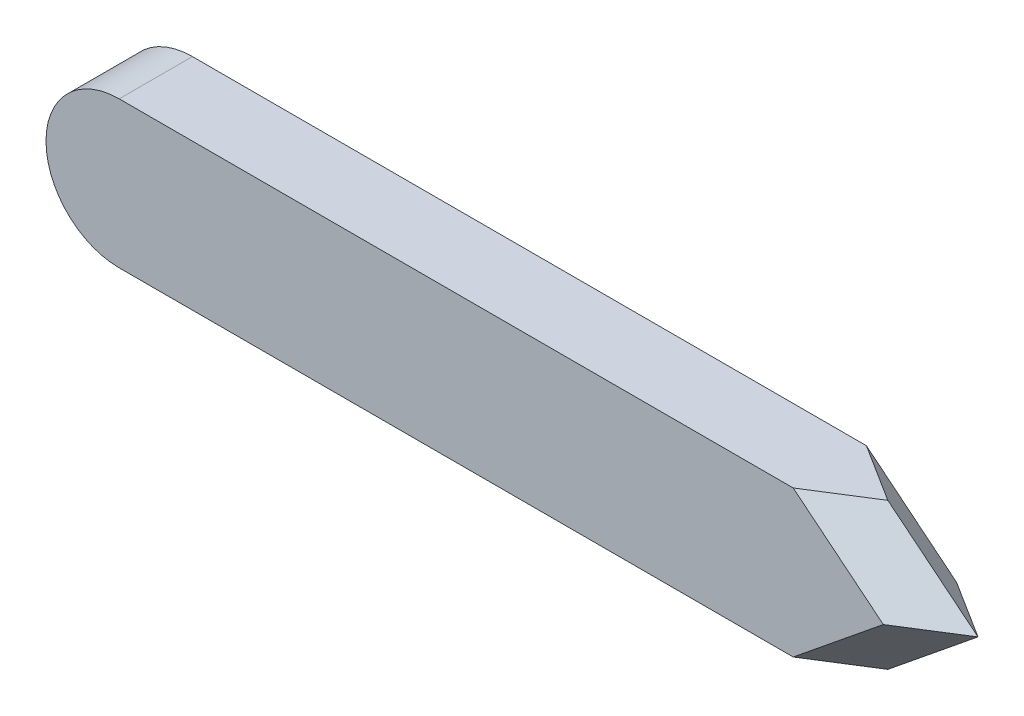
ISO-10303-21;
HEADER;
FILE_DESCRIPTION(('STEP AP214'),'2;1');
FILE_NAME('part.step','',(''),(''),'','','');
FILE_SCHEMA(('AUTOMOTIVE_DESIGN { 1 0 10303 214 1 1 1 1 }'));
ENDSEC;
DATA;
#1=APPLICATION_CONTEXT('core data for automotive mechanical design processes');
#2=APPLICATION_PROTOCOL_DEFINITION('international standard','automotive_design',2000,#1);
#3=PRODUCT_CONTEXT('',#1,'mechanical');
#4=PRODUCT('Part','Part','',(#3));
#5=PRODUCT_RELATED_PRODUCT_CATEGORY('part','',(#4));
#6=PRODUCT_DEFINITION_FORMATION('','',#4);
#7=PRODUCT_DEFINITION_CONTEXT('part definition',#1,'design');
#8=PRODUCT_DEFINITION('design','',#6,#7);
#9=PRODUCT_DEFINITION_SHAPE('','',#8);
#10=(LENGTH_UNIT() NAMED_UNIT(*) SI_UNIT(.MILLI.,.METRE.));
#11=(NAMED_UNIT(*) PLANE_ANGLE_UNIT() SI_UNIT($,.RADIAN.));
#12=(NAMED_UNIT(*) SI_UNIT($,.STERADIAN.) SOLID_ANGLE_UNIT());
#13=UNCERTAINTY_MEASURE_WITH_UNIT(LENGTH_MEASURE(1.E-05),#10,'distance_accuracy_value','');
#14=(GEOMETRIC_REPRESENTATION_CONTEXT(3) GLOBAL_UNCERTAINTY_ASSIGNED_CONTEXT((#13)) GLOBAL_UNIT_ASSIGNED_CONTEXT((#10,
#11,#12)) REPRESENTATION_CONTEXT('',''));
#15=CARTESIAN_POINT('',(0.,0.,0.));
#16=DIRECTION('',(0.,0.,1.));
#17=DIRECTION('',(1.,0.,0.));
#18=AXIS2_PLACEMENT_3D('',#15,#16,#17);
#19=CARTESIAN_POINT('',(0.,4.,4.));
#20=DIRECTION('',(0.,-1.,0.));
#21=DIRECTION('',(0.,0.,-1.));
#22=AXIS2_PLACEMENT_3D('',#19,#20,#21);
#23=PLANE('',#22);
#24=DIRECTION('',(0.845954874987214,0.,-0.53325448848122));
#25=VECTOR('',#24,1.);
#26=CARTESIAN_POINT('',(22.3451835566116,4.,13.1288561483745));
#27=LINE('',#26,#25);
#28=CARTESIAN_POINT('',(36.827200170798,4.,4.));
#29=VERTEX_POINT('',#28);
#30=CARTESIAN_POINT('',(40.,4.,1.99999999999999));
#31=VERTEX_POINT('',#30);
#32=EDGE_CURVE('E153',#29,#31,#27,.T.);
#33=ORIENTED_EDGE('',*,*,#32,.T.);
#34=DIRECTION('',(0.845954874987216,0.,0.533254488481216));
#35=VECTOR('',#34,1.);
#36=CARTESIAN_POINT('',(40.,4.,2.));
#37=LINE('',#36,#35);
#38=CARTESIAN_POINT('',(36.8272001707979,4.,0.));
#39=VERTEX_POINT('',#38);
#40=EDGE_CURVE('E156',#31,#39,#37,.F.);
#41=ORIENTED_EDGE('',*,*,#40,.T.);
#42=DIRECTION('',(-1.,0.,0.));
#43=VECTOR('',#42,1.);
#44=CARTESIAN_POINT('',(0.,4.,0.));
#45=LINE('',#44,#43);
#46=CARTESIAN_POINT('',(0.,4.,0.));
#47=VERTEX_POINT('',#46);
#48=EDGE_CURVE('E113',#39,#47,#45,.T.);
#49=ORIENTED_EDGE('',*,*,#48,.T.);
#50=DIRECTION('',(0.,0.,-1.));
#51=VECTOR('',#50,1.);
#52=CARTESIAN_POINT('',(0.,4.,4.));
#53=LINE('',#52,#51);
#54=CARTESIAN_POINT('',(0.,4.,4.));
#55=VERTEX_POINT('',#54);
#56=EDGE_CURVE('E111',#55,#47,#53,.T.);
#57=ORIENTED_EDGE('',*,*,#56,.F.);
#58=DIRECTION('',(-1.,0.,0.));
#59=VECTOR('',#58,1.);
#60=CARTESIAN_POINT('',(0.,4.,4.));
#61=LINE('',#60,#59);
#62=EDGE_CURVE('E99',#29,#55,#61,.T.);
#63=ORIENTED_EDGE('',*,*,#62,.F.);
#64=EDGE_LOOP('',(#33,#41,#49,#57,#63));
#65=FACE_BOUND('',#64,.T.);
#66=ADVANCED_FACE('F47',(#65),#23,.F.);
#67=CARTESIAN_POINT('',(0.,0.,4.));
#68=DIRECTION('',(0.,0.,-1.));
#69=DIRECTION('',(-1.,0.,0.));
#70=AXIS2_PLACEMENT_3D('',#67,#68,#69);
#71=CYLINDRICAL_SURFACE('',#70,4.);
#72=CARTESIAN_POINT('',(0.,0.,0.));
#73=DIRECTION('',(0.,0.,1.));
#74=DIRECTION('',(1.,0.,0.));
#75=AXIS2_PLACEMENT_3D('',#72,#73,#74);
#76=CIRCLE('',#75,4.);
#77=CARTESIAN_POINT('',(0.,-4.,0.));
#78=VERTEX_POINT('',#77);
#79=EDGE_CURVE('E132',#47,#78,#76,.T.);
#80=ORIENTED_EDGE('',*,*,#79,.T.);
#81=DIRECTION('',(0.,0.,-1.));
#82=VECTOR('',#81,1.);
#83=CARTESIAN_POINT('',(0.,-4.,4.));
#84=LINE('',#83,#82);
#85=CARTESIAN_POINT('',(0.,-4.,4.));
#86=VERTEX_POINT('',#85);
#87=EDGE_CURVE('E118',#86,#78,#84,.T.);
#88=ORIENTED_EDGE('',*,*,#87,.F.);
#89=CARTESIAN_POINT('',(0.,0.,4.));
#90=DIRECTION('',(0.,0.,1.));
#91=DIRECTION('',(1.,0.,0.));
#92=AXIS2_PLACEMENT_3D('',#89,#90,#91);
#93=CIRCLE('',#92,4.);
#94=EDGE_CURVE('E103',#55,#86,#93,.T.);
#95=ORIENTED_EDGE('',*,*,#94,.F.);
#96=ORIENTED_EDGE('',*,*,#56,.T.);
#97=EDGE_LOOP('',(#80,#88,#95,#96));
#98=FACE_BOUND('',#97,.T.);
#99=ADVANCED_FACE('F120',(#98),#71,.T.);
#100=CARTESIAN_POINT('',(0.,-4.,4.));
#101=DIRECTION('',(0.,1.,0.));
#102=DIRECTION('',(0.,0.,1.));
#103=AXIS2_PLACEMENT_3D('',#100,#101,#102);
#104=PLANE('',#103);
#105=DIRECTION('',(1.,0.,0.));
#106=VECTOR('',#105,1.);
#107=CARTESIAN_POINT('',(0.,-4.,0.));
#108=LINE('',#107,#106);
#109=CARTESIAN_POINT('',(36.8272001707979,-4.,0.));
#110=VERTEX_POINT('',#109);
#111=EDGE_CURVE('E108',#78,#110,#108,.T.);
#112=ORIENTED_EDGE('',*,*,#111,.T.);
#113=DIRECTION('',(-0.845954874987216,0.,-0.533254488481216));
#114=VECTOR('',#113,1.);
#115=CARTESIAN_POINT('',(40.,-4.,2.));
#116=LINE('',#115,#114);
#117=CARTESIAN_POINT('',(40.,-4.,1.99999999999999));
#118=VERTEX_POINT('',#117);
#119=EDGE_CURVE('E150',#110,#118,#116,.F.);
#120=ORIENTED_EDGE('',*,*,#119,.T.);
#121=DIRECTION('',(-0.845954874987214,0.,0.53325448848122));
#122=VECTOR('',#121,1.);
#123=CARTESIAN_POINT('',(22.3451835566116,-4.,13.1288561483745));
#124=LINE('',#123,#122);
#125=CARTESIAN_POINT('',(36.827200170798,-4.,4.));
#126=VERTEX_POINT('',#125);
#127=EDGE_CURVE('E147',#118,#126,#124,.T.);
#128=ORIENTED_EDGE('',*,*,#127,.T.);
#129=DIRECTION('',(1.,0.,0.));
#130=VECTOR('',#129,1.);
#131=CARTESIAN_POINT('',(0.,-4.,4.));
#132=LINE('',#131,#130);
#133=EDGE_CURVE('E124',#86,#126,#132,.T.);
#134=ORIENTED_EDGE('',*,*,#133,.F.);
#135=ORIENTED_EDGE('',*,*,#87,.T.);
#136=EDGE_LOOP('',(#112,#120,#128,#134,#135));
#137=FACE_BOUND('',#136,.T.);
#138=ADVANCED_FACE('F210',(#137),#104,.F.);
#139=CARTESIAN_POINT('',(0.,0.,4.));
#140=DIRECTION('',(0.,0.,1.));
#141=DIRECTION('',(1.,0.,0.));
#142=AXIS2_PLACEMENT_3D('',#139,#140,#141);
#143=PLANE('',#142);
#144=ORIENTED_EDGE('',*,*,#133,.T.);
#145=DIRECTION('',(0.776304511374301,0.630358077302027,0.));
#146=VECTOR('',#145,1.);
#147=CARTESIAN_POINT('',(43.6654014875903,1.5526090227486,4.));
#148=LINE('',#147,#146);
#149=CARTESIAN_POINT('',(41.7533178129923,0.,4.));
#150=VERTEX_POINT('',#149);
#151=EDGE_CURVE('E11',#126,#150,#148,.T.);
#152=ORIENTED_EDGE('',*,*,#151,.T.);
#153=DIRECTION('',(-0.776304511374301,0.630358077302027,0.));
#154=VECTOR('',#153,1.);
#155=CARTESIAN_POINT('',(38.7392838453959,2.4473909772514,4.));
#156=LINE('',#155,#154);
#157=EDGE_CURVE('E59',#150,#29,#156,.T.);
#158=ORIENTED_EDGE('',*,*,#157,.T.);
#159=ORIENTED_EDGE('',*,*,#62,.T.);
#160=ORIENTED_EDGE('',*,*,#94,.T.);
#161=EDGE_LOOP('',(#144,#152,#158,#159,#160));
#162=FACE_BOUND('',#161,.T.);
#163=ADVANCED_FACE('F101',(#162),#143,.T.);
#164=CARTESIAN_POINT('',(0.,0.,0.));
#165=DIRECTION('',(0.,0.,1.));
#166=DIRECTION('',(1.,0.,0.));
#167=AXIS2_PLACEMENT_3D('',#164,#165,#166);
#168=PLANE('',#167);
#169=CARTESIAN_POINT('',(0.,0.,0.));
#170=DIRECTION('',(0.,0.,-1.));
#171=DIRECTION('',(-1.,0.,0.));
#172=AXIS2_PLACEMENT_3D('',#169,#170,#171);
#173=CIRCLE('',#172,2.6);
#174=CARTESIAN_POINT('',(-2.6,0.,0.));
#175=VERTEX_POINT('',#174);
#176=EDGE_CURVE('E178',#175,#175,#173,.T.);
#177=ORIENTED_EDGE('',*,*,#176,.F.);
#178=EDGE_LOOP('',(#177));
#179=FACE_BOUND('',#178,.T.);
#180=DIRECTION('',(0.776304511374301,-0.630358077302027,0.));
#181=VECTOR('',#180,1.);
#182=CARTESIAN_POINT('',(16.5907353469554,20.4319785224035,0.));
#183=LINE('',#182,#181);
#184=CARTESIAN_POINT('',(41.7533178129923,0.,0.));
#185=VERTEX_POINT('',#184);
#186=EDGE_CURVE('E117',#39,#185,#183,.T.);
#187=ORIENTED_EDGE('',*,*,#186,.T.);
#188=DIRECTION('',(-0.776304511374301,-0.630358077302027,0.));
#189=VECTOR('',#188,1.);
#190=CARTESIAN_POINT('',(16.5907353469554,-20.4319785224035,0.));
#191=LINE('',#190,#189);
#192=EDGE_CURVE('E143',#185,#110,#191,.T.);
#193=ORIENTED_EDGE('',*,*,#192,.T.);
#194=ORIENTED_EDGE('',*,*,#111,.F.);
#195=ORIENTED_EDGE('',*,*,#79,.F.);
#196=ORIENTED_EDGE('',*,*,#48,.F.);
#197=EDGE_LOOP('',(#187,#193,#194,#195,#196));
#198=FACE_BOUND('',#197,.T.);
#199=ADVANCED_FACE('F194',(#179,#198),#168,.F.);
#200=CARTESIAN_POINT('',(0.,0.,2.2));
#201=DIRECTION('',(0.,0.,-1.));
#202=DIRECTION('',(-1.,0.,0.));
#203=AXIS2_PLACEMENT_3D('',#200,#201,#202);
#204=CYLINDRICAL_SURFACE('',#203,2.6);
#205=CARTESIAN_POINT('',(0.,0.,2.2));
#206=DIRECTION('',(0.,0.,-1.));
#207=DIRECTION('',(-1.,0.,0.));
#208=AXIS2_PLACEMENT_3D('',#205,#206,#207);
#209=CIRCLE('',#208,2.6);
#210=CARTESIAN_POINT('',(-2.6,0.,2.2));
#211=VERTEX_POINT('',#210);
#212=EDGE_CURVE('E133',#211,#211,#209,.T.);
#213=ORIENTED_EDGE('',*,*,#212,.F.);
#214=EDGE_LOOP('',(#213));
#215=FACE_BOUND('',#214,.T.);
#216=ORIENTED_EDGE('',*,*,#176,.T.);
#217=EDGE_LOOP('',(#216));
#218=FACE_BOUND('',#217,.T.);
#219=ADVANCED_FACE('F192',(#215,#218),#204,.F.);
#220=CARTESIAN_POINT('',(0.,0.,2.2));
#221=DIRECTION('',(0.,0.,-1.));
#222=DIRECTION('',(-1.,0.,0.));
#223=AXIS2_PLACEMENT_3D('',#220,#221,#222);
#224=PLANE('',#223);
#225=ORIENTED_EDGE('',*,*,#212,.T.);
#226=EDGE_LOOP('',(#225));
#227=FACE_BOUND('',#226,.T.);
#228=ADVANCED_FACE('F190',(#227),#224,.T.);
#229=CARTESIAN_POINT('',(16.5907353469554,20.4319785224035,4.));
#230=DIRECTION('',(0.445730471035978,0.548930184258479,0.707106781186545));
#231=DIRECTION('',(0.776304511374301,-0.630358077302027,0.));
#232=AXIS2_PLACEMENT_3D('',#229,#230,#231);
#233=PLANE('',#232);
#234=ORIENTED_EDGE('',*,*,#32,.F.);
#235=ORIENTED_EDGE('',*,*,#157,.F.);
#236=DIRECTION('',(0.845954874987214,0.,-0.53325448848122));
#237=VECTOR('',#236,1.);
#238=CARTESIAN_POINT('',(23.745976090952,0.,15.3510733052259));
#239=LINE('',#238,#237);
#240=CARTESIAN_POINT('',(44.9261176421943,0.,2.));
#241=VERTEX_POINT('',#240);
#242=EDGE_CURVE('E52',#241,#150,#239,.F.);
#243=ORIENTED_EDGE('',*,*,#242,.F.);
#244=DIRECTION('',(0.776304511374301,-0.630358077302027,0.));
#245=VECTOR('',#244,1.);
#246=CARTESIAN_POINT('',(44.9261176421943,0.,1.99999999999999));
#247=LINE('',#246,#245);
#248=EDGE_CURVE('E168',#31,#241,#247,.T.);
#249=ORIENTED_EDGE('',*,*,#248,.F.);
#250=EDGE_LOOP('',(#234,#235,#243,#249));
#251=FACE_BOUND('',#250,.T.);
#252=ADVANCED_FACE('F50',(#251),#233,.T.);
#253=CARTESIAN_POINT('',(16.5907353469554,-20.4319785224035,4.));
#254=DIRECTION('',(0.445730471035978,-0.548930184258479,0.707106781186545));
#255=DIRECTION('',(-0.776304511374301,-0.630358077302027,0.));
#256=AXIS2_PLACEMENT_3D('',#253,#254,#255);
#257=PLANE('',#256);
#258=ORIENTED_EDGE('',*,*,#151,.F.);
#259=ORIENTED_EDGE('',*,*,#127,.F.);
#260=DIRECTION('',(-0.776304511374301,-0.630358077302027,0.));
#261=VECTOR('',#260,1.);
#262=CARTESIAN_POINT('',(40.,-4.,1.99999999999999));
#263=LINE('',#262,#261);
#264=EDGE_CURVE('E165',#241,#118,#263,.T.);
#265=ORIENTED_EDGE('',*,*,#264,.F.);
#266=ORIENTED_EDGE('',*,*,#242,.T.);
#267=EDGE_LOOP('',(#258,#259,#265,#266));
#268=FACE_BOUND('',#267,.T.);
#269=ADVANCED_FACE('F227',(#268),#257,.T.);
#270=CARTESIAN_POINT('',(40.,4.,2.));
#271=DIRECTION('',(-0.445730471035976,-0.548930184258476,0.707106781186549));
#272=DIRECTION('',(-0.776304511374301,0.630358077302027,0.));
#273=AXIS2_PLACEMENT_3D('',#270,#271,#272);
#274=PLANE('',#273);
#275=ORIENTED_EDGE('',*,*,#40,.F.);
#276=ORIENTED_EDGE('',*,*,#248,.T.);
#277=DIRECTION('',(-0.845954874987216,0.,-0.533254488481216));
#278=VECTOR('',#277,1.);
#279=CARTESIAN_POINT('',(41.4007925343404,0.,-0.222217156851352));
#280=LINE('',#279,#278);
#281=EDGE_CURVE('E161',#185,#241,#280,.F.);
#282=ORIENTED_EDGE('',*,*,#281,.F.);
#283=ORIENTED_EDGE('',*,*,#186,.F.);
#284=EDGE_LOOP('',(#275,#276,#282,#283));
#285=FACE_BOUND('',#284,.T.);
#286=ADVANCED_FACE('F221',(#285),#274,.F.);
#287=CARTESIAN_POINT('',(40.,-4.,2.));
#288=DIRECTION('',(-0.445730471035976,0.548930184258476,0.707106781186549));
#289=DIRECTION('',(0.776304511374301,0.630358077302027,0.));
#290=AXIS2_PLACEMENT_3D('',#287,#288,#289);
#291=PLANE('',#290);
#292=ORIENTED_EDGE('',*,*,#119,.F.);
#293=ORIENTED_EDGE('',*,*,#192,.F.);
#294=ORIENTED_EDGE('',*,*,#281,.T.);
#295=ORIENTED_EDGE('',*,*,#264,.T.);
#296=EDGE_LOOP('',(#292,#293,#294,#295));
#297=FACE_BOUND('',#296,.T.);
#298=ADVANCED_FACE('F215',(#297),#291,.F.);
#299=CLOSED_SHELL('',(#66,#99,#138,#163,#199,#219,#228,#252,#269,#286,#298));
#300=MANIFOLD_SOLID_BREP('B2',#299);
#301=ADVANCED_BREP_SHAPE_REPRESENTATION('',(#18,#300),#14);
#302=SHAPE_DEFINITION_REPRESENTATION(#9,#301);
ENDSEC;
END-ISO-10303-21;
